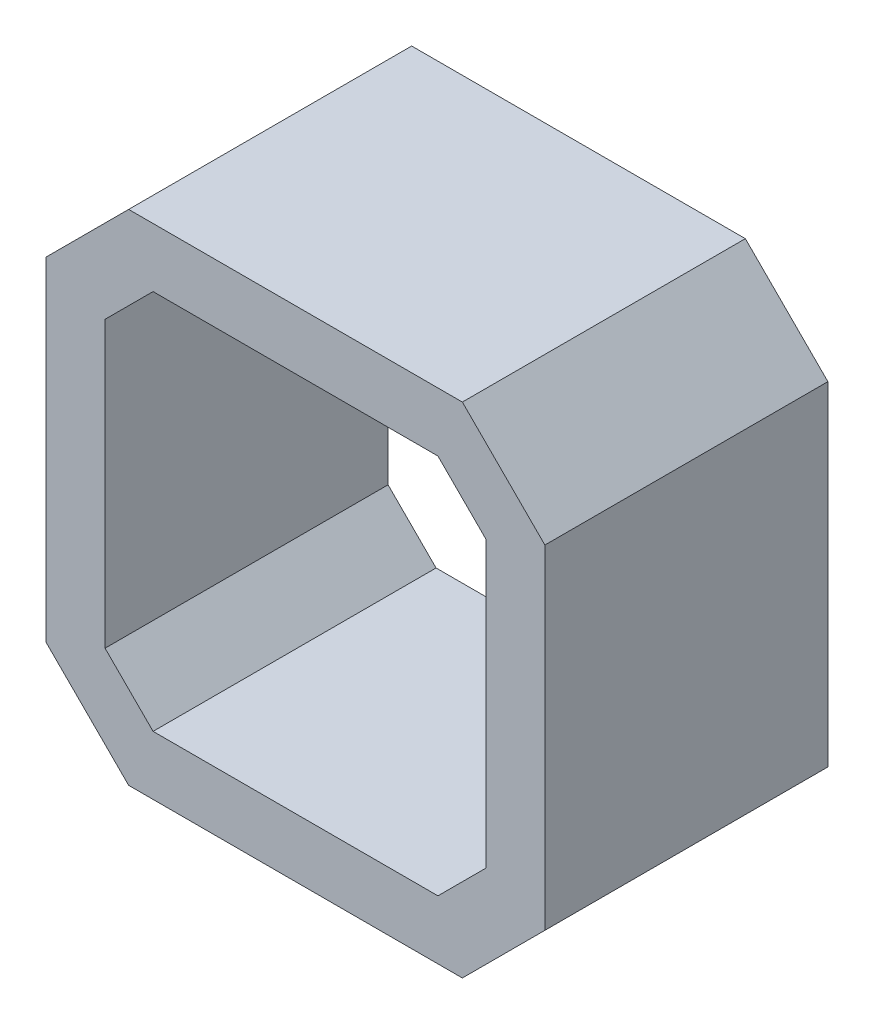
ISO-10303-21;
HEADER;
FILE_DESCRIPTION(('STEP AP214'),'2;1');
FILE_NAME('part.step','',(''),(''),'','','');
FILE_SCHEMA(('AUTOMOTIVE_DESIGN { 1 0 10303 214 1 1 1 1 }'));
ENDSEC;
DATA;
#1=APPLICATION_CONTEXT('core data for automotive mechanical design processes');
#2=APPLICATION_PROTOCOL_DEFINITION('international standard','automotive_design',2000,#1);
#3=PRODUCT_CONTEXT('',#1,'mechanical');
#4=PRODUCT('Part','Part','',(#3));
#5=PRODUCT_RELATED_PRODUCT_CATEGORY('part','',(#4));
#6=PRODUCT_DEFINITION_FORMATION('','',#4);
#7=PRODUCT_DEFINITION_CONTEXT('part definition',#1,'design');
#8=PRODUCT_DEFINITION('design','',#6,#7);
#9=PRODUCT_DEFINITION_SHAPE('','',#8);
#10=(LENGTH_UNIT() NAMED_UNIT(*) SI_UNIT(.MILLI.,.METRE.));
#11=(NAMED_UNIT(*) PLANE_ANGLE_UNIT() SI_UNIT($,.RADIAN.));
#12=(NAMED_UNIT(*) SI_UNIT($,.STERADIAN.) SOLID_ANGLE_UNIT());
#13=UNCERTAINTY_MEASURE_WITH_UNIT(LENGTH_MEASURE(1.E-05),#10,'distance_accuracy_value','');
#14=(GEOMETRIC_REPRESENTATION_CONTEXT(3) GLOBAL_UNCERTAINTY_ASSIGNED_CONTEXT((#13)) GLOBAL_UNIT_ASSIGNED_CONTEXT((#10,
#11,#12)) REPRESENTATION_CONTEXT('',''));
#15=CARTESIAN_POINT('',(0.,0.,0.));
#16=DIRECTION('',(0.,0.,1.));
#17=DIRECTION('',(1.,0.,0.));
#18=AXIS2_PLACEMENT_3D('',#15,#16,#17);
#19=CARTESIAN_POINT('',(0.,0.,24.));
#20=DIRECTION('',(0.,0.,-1.));
#21=DIRECTION('',(-1.,0.,0.));
#22=AXIS2_PLACEMENT_3D('',#19,#20,#21);
#23=PLANE('',#22);
#24=DIRECTION('',(-1.,0.,0.));
#25=VECTOR('',#24,1.);
#26=CARTESIAN_POINT('',(14.15,21.15,24.));
#27=LINE('',#26,#25);
#28=CARTESIAN_POINT('',(14.15,21.15,24.));
#29=VERTEX_POINT('',#28);
#30=CARTESIAN_POINT('',(-14.15,21.15,24.));
#31=VERTEX_POINT('',#30);
#32=EDGE_CURVE('E210',#29,#31,#27,.T.);
#33=ORIENTED_EDGE('',*,*,#32,.T.);
#34=DIRECTION('',(-0.707106781186548,-0.707106781186547,0.));
#35=VECTOR('',#34,1.);
#36=CARTESIAN_POINT('',(-14.15,21.15,24.));
#37=LINE('',#36,#35);
#38=CARTESIAN_POINT('',(-21.15,14.15,24.));
#39=VERTEX_POINT('',#38);
#40=EDGE_CURVE('E213',#31,#39,#37,.T.);
#41=ORIENTED_EDGE('',*,*,#40,.T.);
#42=DIRECTION('',(0.,-1.,0.));
#43=VECTOR('',#42,1.);
#44=CARTESIAN_POINT('',(-21.15,-14.15,24.));
#45=LINE('',#44,#43);
#46=CARTESIAN_POINT('',(-21.15,-14.15,24.));
#47=VERTEX_POINT('',#46);
#48=EDGE_CURVE('E216',#39,#47,#45,.T.);
#49=ORIENTED_EDGE('',*,*,#48,.T.);
#50=DIRECTION('',(0.707106781186547,-0.707106781186547,0.));
#51=VECTOR('',#50,1.);
#52=CARTESIAN_POINT('',(-14.15,-21.15,24.));
#53=LINE('',#52,#51);
#54=CARTESIAN_POINT('',(-14.15,-21.15,24.));
#55=VERTEX_POINT('',#54);
#56=EDGE_CURVE('E218',#47,#55,#53,.T.);
#57=ORIENTED_EDGE('',*,*,#56,.T.);
#58=DIRECTION('',(1.,0.,0.));
#59=VECTOR('',#58,1.);
#60=CARTESIAN_POINT('',(14.15,-21.15,24.));
#61=LINE('',#60,#59);
#62=CARTESIAN_POINT('',(14.15,-21.15,24.));
#63=VERTEX_POINT('',#62);
#64=EDGE_CURVE('E220',#55,#63,#61,.T.);
#65=ORIENTED_EDGE('',*,*,#64,.T.);
#66=DIRECTION('',(0.707106781186547,0.707106781186548,0.));
#67=VECTOR('',#66,1.);
#68=CARTESIAN_POINT('',(21.15,-14.15,24.));
#69=LINE('',#68,#67);
#70=CARTESIAN_POINT('',(21.15,-14.15,24.));
#71=VERTEX_POINT('',#70);
#72=EDGE_CURVE('E222',#63,#71,#69,.T.);
#73=ORIENTED_EDGE('',*,*,#72,.T.);
#74=DIRECTION('',(0.,1.,0.));
#75=VECTOR('',#74,1.);
#76=CARTESIAN_POINT('',(21.15,-14.15,24.));
#77=LINE('',#76,#75);
#78=CARTESIAN_POINT('',(21.15,14.15,24.));
#79=VERTEX_POINT('',#78);
#80=EDGE_CURVE('E224',#71,#79,#77,.T.);
#81=ORIENTED_EDGE('',*,*,#80,.T.);
#82=DIRECTION('',(-0.707106781186547,0.707106781186548,0.));
#83=VECTOR('',#82,1.);
#84=CARTESIAN_POINT('',(21.15,14.15,24.));
#85=LINE('',#84,#83);
#86=EDGE_CURVE('E226',#79,#29,#85,.T.);
#87=ORIENTED_EDGE('',*,*,#86,.T.);
#88=EDGE_LOOP('',(#33,#41,#49,#57,#65,#73,#81,#87));
#89=FACE_BOUND('',#88,.T.);
#90=DIRECTION('',(-0.707106781186547,0.707106781186547,0.));
#91=VECTOR('',#90,1.);
#92=CARTESIAN_POINT('',(16.15,12.0789321881345,24.));
#93=LINE('',#92,#91);
#94=CARTESIAN_POINT('',(16.15,12.0789321881345,24.));
#95=VERTEX_POINT('',#94);
#96=CARTESIAN_POINT('',(12.0789321881345,16.15,24.));
#97=VERTEX_POINT('',#96);
#98=EDGE_CURVE('E145',#95,#97,#93,.T.);
#99=ORIENTED_EDGE('',*,*,#98,.F.);
#100=DIRECTION('',(0.,1.,0.));
#101=VECTOR('',#100,1.);
#102=CARTESIAN_POINT('',(16.15,-12.0789321881345,24.));
#103=LINE('',#102,#101);
#104=CARTESIAN_POINT('',(16.15,-12.0789321881345,24.));
#105=VERTEX_POINT('',#104);
#106=EDGE_CURVE('E178',#105,#95,#103,.T.);
#107=ORIENTED_EDGE('',*,*,#106,.F.);
#108=DIRECTION('',(0.707106781186547,0.707106781186547,0.));
#109=VECTOR('',#108,1.);
#110=CARTESIAN_POINT('',(16.15,-12.0789321881345,24.));
#111=LINE('',#110,#109);
#112=CARTESIAN_POINT('',(12.0789321881345,-16.15,24.));
#113=VERTEX_POINT('',#112);
#114=EDGE_CURVE('E176',#113,#105,#111,.T.);
#115=ORIENTED_EDGE('',*,*,#114,.F.);
#116=DIRECTION('',(1.,0.,0.));
#117=VECTOR('',#116,1.);
#118=CARTESIAN_POINT('',(12.0789321881345,-16.15,24.));
#119=LINE('',#118,#117);
#120=CARTESIAN_POINT('',(-12.0789321881345,-16.15,24.));
#121=VERTEX_POINT('',#120);
#122=EDGE_CURVE('E174',#121,#113,#119,.T.);
#123=ORIENTED_EDGE('',*,*,#122,.F.);
#124=DIRECTION('',(0.707106781186547,-0.707106781186547,0.));
#125=VECTOR('',#124,1.);
#126=CARTESIAN_POINT('',(-12.0789321881345,-16.15,24.));
#127=LINE('',#126,#125);
#128=CARTESIAN_POINT('',(-16.15,-12.0789321881345,24.));
#129=VERTEX_POINT('',#128);
#130=EDGE_CURVE('E172',#129,#121,#127,.T.);
#131=ORIENTED_EDGE('',*,*,#130,.F.);
#132=DIRECTION('',(0.,-1.,0.));
#133=VECTOR('',#132,1.);
#134=CARTESIAN_POINT('',(-16.15,-12.0789321881345,24.));
#135=LINE('',#134,#133);
#136=CARTESIAN_POINT('',(-16.15,12.0789321881345,24.));
#137=VERTEX_POINT('',#136);
#138=EDGE_CURVE('E168',#137,#129,#135,.T.);
#139=ORIENTED_EDGE('',*,*,#138,.F.);
#140=DIRECTION('',(-0.707106781186547,-0.707106781186547,0.));
#141=VECTOR('',#140,1.);
#142=CARTESIAN_POINT('',(-12.0789321881345,16.15,24.));
#143=LINE('',#142,#141);
#144=CARTESIAN_POINT('',(-12.0789321881345,16.15,24.));
#145=VERTEX_POINT('',#144);
#146=EDGE_CURVE('E166',#145,#137,#143,.T.);
#147=ORIENTED_EDGE('',*,*,#146,.F.);
#148=DIRECTION('',(-1.,0.,0.));
#149=VECTOR('',#148,1.);
#150=CARTESIAN_POINT('',(12.0789321881345,16.15,24.));
#151=LINE('',#150,#149);
#152=EDGE_CURVE('E153',#97,#145,#151,.T.);
#153=ORIENTED_EDGE('',*,*,#152,.F.);
#154=EDGE_LOOP('',(#99,#107,#115,#123,#131,#139,#147,#153));
#155=FACE_BOUND('',#154,.T.);
#156=ADVANCED_FACE('F32',(#89,#155),#23,.F.);
#157=CARTESIAN_POINT('',(0.,0.,0.));
#158=DIRECTION('',(0.,0.,-1.));
#159=DIRECTION('',(-1.,0.,0.));
#160=AXIS2_PLACEMENT_3D('',#157,#158,#159);
#161=PLANE('',#160);
#162=DIRECTION('',(-1.,0.,0.));
#163=VECTOR('',#162,1.);
#164=CARTESIAN_POINT('',(14.15,21.15,0.));
#165=LINE('',#164,#163);
#166=CARTESIAN_POINT('',(14.15,21.15,0.));
#167=VERTEX_POINT('',#166);
#168=CARTESIAN_POINT('',(-14.15,21.15,0.));
#169=VERTEX_POINT('',#168);
#170=EDGE_CURVE('E161',#167,#169,#165,.T.);
#171=ORIENTED_EDGE('',*,*,#170,.F.);
#172=DIRECTION('',(-0.707106781186547,0.707106781186548,0.));
#173=VECTOR('',#172,1.);
#174=CARTESIAN_POINT('',(21.15,14.15,0.));
#175=LINE('',#174,#173);
#176=CARTESIAN_POINT('',(21.15,14.15,0.));
#177=VERTEX_POINT('',#176);
#178=EDGE_CURVE('E214',#177,#167,#175,.T.);
#179=ORIENTED_EDGE('',*,*,#178,.F.);
#180=DIRECTION('',(0.,1.,0.));
#181=VECTOR('',#180,1.);
#182=CARTESIAN_POINT('',(21.15,-14.15,0.));
#183=LINE('',#182,#181);
#184=CARTESIAN_POINT('',(21.15,-14.15,0.));
#185=VERTEX_POINT('',#184);
#186=EDGE_CURVE('E241',#185,#177,#183,.T.);
#187=ORIENTED_EDGE('',*,*,#186,.F.);
#188=DIRECTION('',(0.707106781186547,0.707106781186548,0.));
#189=VECTOR('',#188,1.);
#190=CARTESIAN_POINT('',(21.15,-14.15,0.));
#191=LINE('',#190,#189);
#192=CARTESIAN_POINT('',(14.15,-21.15,0.));
#193=VERTEX_POINT('',#192);
#194=EDGE_CURVE('E239',#193,#185,#191,.T.);
#195=ORIENTED_EDGE('',*,*,#194,.F.);
#196=DIRECTION('',(1.,0.,0.));
#197=VECTOR('',#196,1.);
#198=CARTESIAN_POINT('',(14.15,-21.15,0.));
#199=LINE('',#198,#197);
#200=CARTESIAN_POINT('',(-14.15,-21.15,0.));
#201=VERTEX_POINT('',#200);
#202=EDGE_CURVE('E237',#201,#193,#199,.T.);
#203=ORIENTED_EDGE('',*,*,#202,.F.);
#204=DIRECTION('',(0.707106781186547,-0.707106781186547,0.));
#205=VECTOR('',#204,1.);
#206=CARTESIAN_POINT('',(-14.15,-21.15,0.));
#207=LINE('',#206,#205);
#208=CARTESIAN_POINT('',(-21.15,-14.15,0.));
#209=VERTEX_POINT('',#208);
#210=EDGE_CURVE('E235',#209,#201,#207,.T.);
#211=ORIENTED_EDGE('',*,*,#210,.F.);
#212=DIRECTION('',(0.,-1.,0.));
#213=VECTOR('',#212,1.);
#214=CARTESIAN_POINT('',(-21.15,-14.15,0.));
#215=LINE('',#214,#213);
#216=CARTESIAN_POINT('',(-21.15,14.15,0.));
#217=VERTEX_POINT('',#216);
#218=EDGE_CURVE('E233',#217,#209,#215,.T.);
#219=ORIENTED_EDGE('',*,*,#218,.F.);
#220=DIRECTION('',(-0.707106781186548,-0.707106781186547,0.));
#221=VECTOR('',#220,1.);
#222=CARTESIAN_POINT('',(-14.15,21.15,0.));
#223=LINE('',#222,#221);
#224=EDGE_CURVE('E231',#169,#217,#223,.T.);
#225=ORIENTED_EDGE('',*,*,#224,.F.);
#226=EDGE_LOOP('',(#171,#179,#187,#195,#203,#211,#219,#225));
#227=FACE_BOUND('',#226,.T.);
#228=DIRECTION('',(0.,1.,0.));
#229=VECTOR('',#228,1.);
#230=CARTESIAN_POINT('',(16.15,-12.0789321881345,0.));
#231=LINE('',#230,#229);
#232=CARTESIAN_POINT('',(16.15,-12.0789321881345,0.));
#233=VERTEX_POINT('',#232);
#234=CARTESIAN_POINT('',(16.15,12.0789321881345,0.));
#235=VERTEX_POINT('',#234);
#236=EDGE_CURVE('E154',#233,#235,#231,.T.);
#237=ORIENTED_EDGE('',*,*,#236,.T.);
#238=DIRECTION('',(-0.707106781186547,0.707106781186547,0.));
#239=VECTOR('',#238,1.);
#240=CARTESIAN_POINT('',(16.15,12.0789321881345,0.));
#241=LINE('',#240,#239);
#242=CARTESIAN_POINT('',(12.0789321881345,16.15,0.));
#243=VERTEX_POINT('',#242);
#244=EDGE_CURVE('E55',#235,#243,#241,.T.);
#245=ORIENTED_EDGE('',*,*,#244,.T.);
#246=DIRECTION('',(-1.,0.,0.));
#247=VECTOR('',#246,1.);
#248=CARTESIAN_POINT('',(12.0789321881345,16.15,0.));
#249=LINE('',#248,#247);
#250=CARTESIAN_POINT('',(-12.0789321881345,16.15,0.));
#251=VERTEX_POINT('',#250);
#252=EDGE_CURVE('E160',#243,#251,#249,.T.);
#253=ORIENTED_EDGE('',*,*,#252,.T.);
#254=DIRECTION('',(-0.707106781186547,-0.707106781186547,0.));
#255=VECTOR('',#254,1.);
#256=CARTESIAN_POINT('',(-12.0789321881345,16.15,0.));
#257=LINE('',#256,#255);
#258=CARTESIAN_POINT('',(-16.15,12.0789321881345,0.));
#259=VERTEX_POINT('',#258);
#260=EDGE_CURVE('E182',#251,#259,#257,.T.);
#261=ORIENTED_EDGE('',*,*,#260,.T.);
#262=DIRECTION('',(0.,-1.,0.));
#263=VECTOR('',#262,1.);
#264=CARTESIAN_POINT('',(-16.15,-12.0789321881345,0.));
#265=LINE('',#264,#263);
#266=CARTESIAN_POINT('',(-16.15,-12.0789321881345,0.));
#267=VERTEX_POINT('',#266);
#268=EDGE_CURVE('E185',#259,#267,#265,.T.);
#269=ORIENTED_EDGE('',*,*,#268,.T.);
#270=DIRECTION('',(0.707106781186547,-0.707106781186547,0.));
#271=VECTOR('',#270,1.);
#272=CARTESIAN_POINT('',(-12.0789321881345,-16.15,0.));
#273=LINE('',#272,#271);
#274=CARTESIAN_POINT('',(-12.0789321881345,-16.15,0.));
#275=VERTEX_POINT('',#274);
#276=EDGE_CURVE('E188',#267,#275,#273,.T.);
#277=ORIENTED_EDGE('',*,*,#276,.T.);
#278=DIRECTION('',(1.,0.,0.));
#279=VECTOR('',#278,1.);
#280=CARTESIAN_POINT('',(12.0789321881345,-16.15,0.));
#281=LINE('',#280,#279);
#282=CARTESIAN_POINT('',(12.0789321881345,-16.15,0.));
#283=VERTEX_POINT('',#282);
#284=EDGE_CURVE('E191',#275,#283,#281,.T.);
#285=ORIENTED_EDGE('',*,*,#284,.T.);
#286=DIRECTION('',(0.707106781186547,0.707106781186547,0.));
#287=VECTOR('',#286,1.);
#288=CARTESIAN_POINT('',(16.15,-12.0789321881345,0.));
#289=LINE('',#288,#287);
#290=EDGE_CURVE('E194',#283,#233,#289,.T.);
#291=ORIENTED_EDGE('',*,*,#290,.T.);
#292=EDGE_LOOP('',(#237,#245,#253,#261,#269,#277,#285,#291));
#293=FACE_BOUND('',#292,.T.);
#294=ADVANCED_FACE('F271',(#227,#293),#161,.T.);
#295=CARTESIAN_POINT('',(14.15,21.15,24.));
#296=DIRECTION('',(0.,-1.,0.));
#297=DIRECTION('',(1.,0.,0.));
#298=AXIS2_PLACEMENT_3D('',#295,#296,#297);
#299=PLANE('',#298);
#300=ORIENTED_EDGE('',*,*,#170,.T.);
#301=DIRECTION('',(0.,0.,-1.));
#302=VECTOR('',#301,1.);
#303=CARTESIAN_POINT('',(-14.15,21.15,24.));
#304=LINE('',#303,#302);
#305=EDGE_CURVE('E11',#31,#169,#304,.T.);
#306=ORIENTED_EDGE('',*,*,#305,.F.);
#307=ORIENTED_EDGE('',*,*,#32,.F.);
#308=DIRECTION('',(0.,0.,-1.));
#309=VECTOR('',#308,1.);
#310=CARTESIAN_POINT('',(14.15,21.15,24.));
#311=LINE('',#310,#309);
#312=EDGE_CURVE('E228',#29,#167,#311,.T.);
#313=ORIENTED_EDGE('',*,*,#312,.T.);
#314=EDGE_LOOP('',(#300,#306,#307,#313));
#315=FACE_BOUND('',#314,.T.);
#316=ADVANCED_FACE('F34',(#315),#299,.F.);
#317=CARTESIAN_POINT('',(-14.15,21.15,24.));
#318=DIRECTION('',(0.707106781186547,-0.707106781186548,0.));
#319=DIRECTION('',(0.707106781186548,0.707106781186547,0.));
#320=AXIS2_PLACEMENT_3D('',#317,#318,#319);
#321=PLANE('',#320);
#322=ORIENTED_EDGE('',*,*,#224,.T.);
#323=DIRECTION('',(0.,0.,-1.));
#324=VECTOR('',#323,1.);
#325=CARTESIAN_POINT('',(-21.15,14.15,24.));
#326=LINE('',#325,#324);
#327=EDGE_CURVE('E40',#39,#217,#326,.T.);
#328=ORIENTED_EDGE('',*,*,#327,.F.);
#329=ORIENTED_EDGE('',*,*,#40,.F.);
#330=ORIENTED_EDGE('',*,*,#305,.T.);
#331=EDGE_LOOP('',(#322,#328,#329,#330));
#332=FACE_BOUND('',#331,.T.);
#333=ADVANCED_FACE('F288',(#332),#321,.F.);
#334=CARTESIAN_POINT('',(-21.15,-14.15,24.));
#335=DIRECTION('',(1.,0.,0.));
#336=DIRECTION('',(0.,0.,-1.));
#337=AXIS2_PLACEMENT_3D('',#334,#335,#336);
#338=PLANE('',#337);
#339=ORIENTED_EDGE('',*,*,#218,.T.);
#340=DIRECTION('',(0.,0.,-1.));
#341=VECTOR('',#340,1.);
#342=CARTESIAN_POINT('',(-21.15,-14.15,24.));
#343=LINE('',#342,#341);
#344=EDGE_CURVE('E258',#47,#209,#343,.T.);
#345=ORIENTED_EDGE('',*,*,#344,.F.);
#346=ORIENTED_EDGE('',*,*,#48,.F.);
#347=ORIENTED_EDGE('',*,*,#327,.T.);
#348=EDGE_LOOP('',(#339,#345,#346,#347));
#349=FACE_BOUND('',#348,.T.);
#350=ADVANCED_FACE('F265',(#349),#338,.F.);
#351=CARTESIAN_POINT('',(-14.15,-21.15,24.));
#352=DIRECTION('',(0.707106781186548,0.707106781186548,0.));
#353=DIRECTION('',(-0.707106781186548,0.707106781186548,0.));
#354=AXIS2_PLACEMENT_3D('',#351,#352,#353);
#355=PLANE('',#354);
#356=ORIENTED_EDGE('',*,*,#210,.T.);
#357=DIRECTION('',(0.,0.,-1.));
#358=VECTOR('',#357,1.);
#359=CARTESIAN_POINT('',(-14.15,-21.15,24.));
#360=LINE('',#359,#358);
#361=EDGE_CURVE('E255',#55,#201,#360,.T.);
#362=ORIENTED_EDGE('',*,*,#361,.F.);
#363=ORIENTED_EDGE('',*,*,#56,.F.);
#364=ORIENTED_EDGE('',*,*,#344,.T.);
#365=EDGE_LOOP('',(#356,#362,#363,#364));
#366=FACE_BOUND('',#365,.T.);
#367=ADVANCED_FACE('F277',(#366),#355,.F.);
#368=CARTESIAN_POINT('',(14.15,-21.15,24.));
#369=DIRECTION('',(0.,1.,0.));
#370=DIRECTION('',(-1.,0.,0.));
#371=AXIS2_PLACEMENT_3D('',#368,#369,#370);
#372=PLANE('',#371);
#373=ORIENTED_EDGE('',*,*,#202,.T.);
#374=DIRECTION('',(0.,0.,-1.));
#375=VECTOR('',#374,1.);
#376=CARTESIAN_POINT('',(14.15,-21.15,24.));
#377=LINE('',#376,#375);
#378=EDGE_CURVE('E252',#63,#193,#377,.T.);
#379=ORIENTED_EDGE('',*,*,#378,.F.);
#380=ORIENTED_EDGE('',*,*,#64,.F.);
#381=ORIENTED_EDGE('',*,*,#361,.T.);
#382=EDGE_LOOP('',(#373,#379,#380,#381));
#383=FACE_BOUND('',#382,.T.);
#384=ADVANCED_FACE('F281',(#383),#372,.F.);
#385=CARTESIAN_POINT('',(21.15,-14.15,24.));
#386=DIRECTION('',(-0.707106781186548,0.707106781186547,0.));
#387=DIRECTION('',(-0.707106781186547,-0.707106781186548,0.));
#388=AXIS2_PLACEMENT_3D('',#385,#386,#387);
#389=PLANE('',#388);
#390=ORIENTED_EDGE('',*,*,#194,.T.);
#391=DIRECTION('',(0.,0.,-1.));
#392=VECTOR('',#391,1.);
#393=CARTESIAN_POINT('',(21.15,-14.15,24.));
#394=LINE('',#393,#392);
#395=EDGE_CURVE('E249',#71,#185,#394,.T.);
#396=ORIENTED_EDGE('',*,*,#395,.F.);
#397=ORIENTED_EDGE('',*,*,#72,.F.);
#398=ORIENTED_EDGE('',*,*,#378,.T.);
#399=EDGE_LOOP('',(#390,#396,#397,#398));
#400=FACE_BOUND('',#399,.T.);
#401=ADVANCED_FACE('F301',(#400),#389,.F.);
#402=CARTESIAN_POINT('',(21.15,-14.15,24.));
#403=DIRECTION('',(-1.,0.,0.));
#404=DIRECTION('',(0.,0.,1.));
#405=AXIS2_PLACEMENT_3D('',#402,#403,#404);
#406=PLANE('',#405);
#407=ORIENTED_EDGE('',*,*,#186,.T.);
#408=DIRECTION('',(0.,0.,-1.));
#409=VECTOR('',#408,1.);
#410=CARTESIAN_POINT('',(21.15,14.15,24.));
#411=LINE('',#410,#409);
#412=EDGE_CURVE('E246',#79,#177,#411,.T.);
#413=ORIENTED_EDGE('',*,*,#412,.F.);
#414=ORIENTED_EDGE('',*,*,#80,.F.);
#415=ORIENTED_EDGE('',*,*,#395,.T.);
#416=EDGE_LOOP('',(#407,#413,#414,#415));
#417=FACE_BOUND('',#416,.T.);
#418=ADVANCED_FACE('F299',(#417),#406,.F.);
#419=CARTESIAN_POINT('',(21.15,14.15,24.));
#420=DIRECTION('',(-0.707106781186548,-0.707106781186547,0.));
#421=DIRECTION('',(0.707106781186547,-0.707106781186548,0.));
#422=AXIS2_PLACEMENT_3D('',#419,#420,#421);
#423=PLANE('',#422);
#424=ORIENTED_EDGE('',*,*,#178,.T.);
#425=ORIENTED_EDGE('',*,*,#312,.F.);
#426=ORIENTED_EDGE('',*,*,#86,.F.);
#427=ORIENTED_EDGE('',*,*,#412,.T.);
#428=EDGE_LOOP('',(#424,#425,#426,#427));
#429=FACE_BOUND('',#428,.T.);
#430=ADVANCED_FACE('F294',(#429),#423,.F.);
#431=CARTESIAN_POINT('',(16.15,12.0789321881345,24.));
#432=DIRECTION('',(-0.707106781186548,-0.707106781186548,0.));
#433=DIRECTION('',(0.707106781186548,-0.707106781186548,0.));
#434=AXIS2_PLACEMENT_3D('',#431,#432,#433);
#435=PLANE('',#434);
#436=ORIENTED_EDGE('',*,*,#244,.F.);
#437=DIRECTION('',(0.,0.,-1.));
#438=VECTOR('',#437,1.);
#439=CARTESIAN_POINT('',(16.15,12.0789321881345,24.));
#440=LINE('',#439,#438);
#441=EDGE_CURVE('E149',#95,#235,#440,.T.);
#442=ORIENTED_EDGE('',*,*,#441,.F.);
#443=ORIENTED_EDGE('',*,*,#98,.T.);
#444=DIRECTION('',(0.,0.,-1.));
#445=VECTOR('',#444,1.);
#446=CARTESIAN_POINT('',(12.0789321881345,16.15,24.));
#447=LINE('',#446,#445);
#448=EDGE_CURVE('E148',#97,#243,#447,.T.);
#449=ORIENTED_EDGE('',*,*,#448,.T.);
#450=EDGE_LOOP('',(#436,#442,#443,#449));
#451=FACE_BOUND('',#450,.T.);
#452=ADVANCED_FACE('F147',(#451),#435,.T.);
#453=CARTESIAN_POINT('',(12.0789321881345,16.15,24.));
#454=DIRECTION('',(0.,-1.,0.));
#455=DIRECTION('',(0.,0.,-1.));
#456=AXIS2_PLACEMENT_3D('',#453,#454,#455);
#457=PLANE('',#456);
#458=ORIENTED_EDGE('',*,*,#252,.F.);
#459=ORIENTED_EDGE('',*,*,#448,.F.);
#460=ORIENTED_EDGE('',*,*,#152,.T.);
#461=DIRECTION('',(0.,0.,-1.));
#462=VECTOR('',#461,1.);
#463=CARTESIAN_POINT('',(-12.0789321881345,16.15,24.));
#464=LINE('',#463,#462);
#465=EDGE_CURVE('E162',#145,#251,#464,.T.);
#466=ORIENTED_EDGE('',*,*,#465,.T.);
#467=EDGE_LOOP('',(#458,#459,#460,#466));
#468=FACE_BOUND('',#467,.T.);
#469=ADVANCED_FACE('F157',(#468),#457,.T.);
#470=CARTESIAN_POINT('',(-12.0789321881345,16.15,24.));
#471=DIRECTION('',(0.707106781186548,-0.707106781186548,0.));
#472=DIRECTION('',(0.707106781186548,0.707106781186548,0.));
#473=AXIS2_PLACEMENT_3D('',#470,#471,#472);
#474=PLANE('',#473);
#475=ORIENTED_EDGE('',*,*,#260,.F.);
#476=ORIENTED_EDGE('',*,*,#465,.F.);
#477=ORIENTED_EDGE('',*,*,#146,.T.);
#478=DIRECTION('',(0.,0.,-1.));
#479=VECTOR('',#478,1.);
#480=CARTESIAN_POINT('',(-16.15,12.0789321881345,24.));
#481=LINE('',#480,#479);
#482=EDGE_CURVE('E207',#137,#259,#481,.T.);
#483=ORIENTED_EDGE('',*,*,#482,.T.);
#484=EDGE_LOOP('',(#475,#476,#477,#483));
#485=FACE_BOUND('',#484,.T.);
#486=ADVANCED_FACE('F326',(#485),#474,.T.);
#487=CARTESIAN_POINT('',(-16.15,-12.0789321881345,24.));
#488=DIRECTION('',(1.,0.,0.));
#489=DIRECTION('',(0.,0.,-1.));
#490=AXIS2_PLACEMENT_3D('',#487,#488,#489);
#491=PLANE('',#490);
#492=ORIENTED_EDGE('',*,*,#268,.F.);
#493=ORIENTED_EDGE('',*,*,#482,.F.);
#494=ORIENTED_EDGE('',*,*,#138,.T.);
#495=DIRECTION('',(0.,0.,-1.));
#496=VECTOR('',#495,1.);
#497=CARTESIAN_POINT('',(-16.15,-12.0789321881345,24.));
#498=LINE('',#497,#496);
#499=EDGE_CURVE('E205',#129,#267,#498,.T.);
#500=ORIENTED_EDGE('',*,*,#499,.T.);
#501=EDGE_LOOP('',(#492,#493,#494,#500));
#502=FACE_BOUND('',#501,.T.);
#503=ADVANCED_FACE('F330',(#502),#491,.T.);
#504=CARTESIAN_POINT('',(-12.0789321881345,-16.15,24.));
#505=DIRECTION('',(0.707106781186548,0.707106781186548,0.));
#506=DIRECTION('',(-0.707106781186548,0.707106781186548,0.));
#507=AXIS2_PLACEMENT_3D('',#504,#505,#506);
#508=PLANE('',#507);
#509=ORIENTED_EDGE('',*,*,#276,.F.);
#510=ORIENTED_EDGE('',*,*,#499,.F.);
#511=ORIENTED_EDGE('',*,*,#130,.T.);
#512=DIRECTION('',(0.,0.,-1.));
#513=VECTOR('',#512,1.);
#514=CARTESIAN_POINT('',(-12.0789321881345,-16.15,24.));
#515=LINE('',#514,#513);
#516=EDGE_CURVE('E203',#121,#275,#515,.T.);
#517=ORIENTED_EDGE('',*,*,#516,.T.);
#518=EDGE_LOOP('',(#509,#510,#511,#517));
#519=FACE_BOUND('',#518,.T.);
#520=ADVANCED_FACE('F336',(#519),#508,.T.);
#521=CARTESIAN_POINT('',(12.0789321881345,-16.15,24.));
#522=DIRECTION('',(0.,1.,0.));
#523=DIRECTION('',(0.,0.,1.));
#524=AXIS2_PLACEMENT_3D('',#521,#522,#523);
#525=PLANE('',#524);
#526=ORIENTED_EDGE('',*,*,#284,.F.);
#527=ORIENTED_EDGE('',*,*,#516,.F.);
#528=ORIENTED_EDGE('',*,*,#122,.T.);
#529=DIRECTION('',(0.,0.,-1.));
#530=VECTOR('',#529,1.);
#531=CARTESIAN_POINT('',(12.0789321881345,-16.15,24.));
#532=LINE('',#531,#530);
#533=EDGE_CURVE('E201',#113,#283,#532,.T.);
#534=ORIENTED_EDGE('',*,*,#533,.T.);
#535=EDGE_LOOP('',(#526,#527,#528,#534));
#536=FACE_BOUND('',#535,.T.);
#537=ADVANCED_FACE('F340',(#536),#525,.T.);
#538=CARTESIAN_POINT('',(16.15,-12.0789321881345,24.));
#539=DIRECTION('',(-0.707106781186548,0.707106781186548,0.));
#540=DIRECTION('',(-0.707106781186548,-0.707106781186548,0.));
#541=AXIS2_PLACEMENT_3D('',#538,#539,#540);
#542=PLANE('',#541);
#543=ORIENTED_EDGE('',*,*,#290,.F.);
#544=ORIENTED_EDGE('',*,*,#533,.F.);
#545=ORIENTED_EDGE('',*,*,#114,.T.);
#546=DIRECTION('',(0.,0.,-1.));
#547=VECTOR('',#546,1.);
#548=CARTESIAN_POINT('',(16.15,-12.0789321881345,24.));
#549=LINE('',#548,#547);
#550=EDGE_CURVE('E47',#105,#233,#549,.T.);
#551=ORIENTED_EDGE('',*,*,#550,.T.);
#552=EDGE_LOOP('',(#543,#544,#545,#551));
#553=FACE_BOUND('',#552,.T.);
#554=ADVANCED_FACE('F344',(#553),#542,.T.);
#555=CARTESIAN_POINT('',(16.15,-12.0789321881345,24.));
#556=DIRECTION('',(-1.,0.,0.));
#557=DIRECTION('',(0.,0.,1.));
#558=AXIS2_PLACEMENT_3D('',#555,#556,#557);
#559=PLANE('',#558);
#560=ORIENTED_EDGE('',*,*,#236,.F.);
#561=ORIENTED_EDGE('',*,*,#550,.F.);
#562=ORIENTED_EDGE('',*,*,#106,.T.);
#563=ORIENTED_EDGE('',*,*,#441,.T.);
#564=EDGE_LOOP('',(#560,#561,#562,#563));
#565=FACE_BOUND('',#564,.T.);
#566=ADVANCED_FACE('F348',(#565),#559,.T.);
#567=CLOSED_SHELL('',(#156,#294,#316,#333,#350,#367,#384,#401,#418,#430,#452,#469,#486,#503,
#520,#537,#554,#566));
#568=MANIFOLD_SOLID_BREP('B2',#567);
#569=ADVANCED_BREP_SHAPE_REPRESENTATION('',(#18,#568),#14);
#570=SHAPE_DEFINITION_REPRESENTATION(#9,#569);
ENDSEC;
END-ISO-10303-21;
